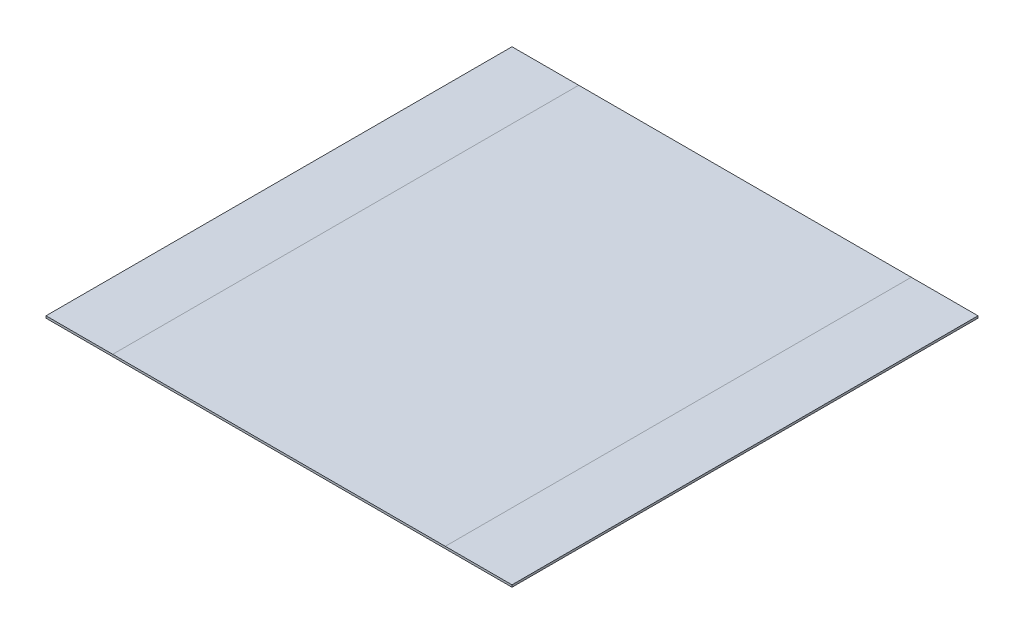
ISO-10303-21;
HEADER;
FILE_DESCRIPTION(('STEP AP214'),'2;1');
FILE_NAME('part.step','',(''),(''),'','','');
FILE_SCHEMA(('AUTOMOTIVE_DESIGN { 1 0 10303 214 1 1 1 1 }'));
ENDSEC;
DATA;
#1=APPLICATION_CONTEXT('core data for automotive mechanical design processes');
#2=APPLICATION_PROTOCOL_DEFINITION('international standard','automotive_design',2000,#1);
#3=PRODUCT_CONTEXT('',#1,'mechanical');
#4=PRODUCT('Part','Part','',(#3));
#5=PRODUCT_RELATED_PRODUCT_CATEGORY('part','',(#4));
#6=PRODUCT_DEFINITION_FORMATION('','',#4);
#7=PRODUCT_DEFINITION_CONTEXT('part definition',#1,'design');
#8=PRODUCT_DEFINITION('design','',#6,#7);
#9=PRODUCT_DEFINITION_SHAPE('','',#8);
#10=(LENGTH_UNIT() NAMED_UNIT(*) SI_UNIT(.MILLI.,.METRE.));
#11=(NAMED_UNIT(*) PLANE_ANGLE_UNIT() SI_UNIT($,.RADIAN.));
#12=(NAMED_UNIT(*) SI_UNIT($,.STERADIAN.) SOLID_ANGLE_UNIT());
#13=UNCERTAINTY_MEASURE_WITH_UNIT(LENGTH_MEASURE(1.E-05),#10,'distance_accuracy_value','');
#14=(GEOMETRIC_REPRESENTATION_CONTEXT(3) GLOBAL_UNCERTAINTY_ASSIGNED_CONTEXT((#13)) GLOBAL_UNIT_ASSIGNED_CONTEXT((#10,
#11,#12)) REPRESENTATION_CONTEXT('',''));
#15=CARTESIAN_POINT('',(0.,0.,0.));
#16=DIRECTION('',(0.,0.,1.));
#17=DIRECTION('',(1.,0.,0.));
#18=AXIS2_PLACEMENT_3D('',#15,#16,#17);
#19=CARTESIAN_POINT('',(0.,0.32,0.));
#20=DIRECTION('',(0.,-1.,0.));
#21=DIRECTION('',(0.,0.,-1.));
#22=AXIS2_PLACEMENT_3D('',#19,#20,#21);
#23=PLANE('',#22);
#24=DIRECTION('',(0.,0.,1.));
#25=VECTOR('',#24,1.);
#26=CARTESIAN_POINT('',(49.85,0.32,0.));
#27=LINE('',#26,#25);
#28=CARTESIAN_POINT('',(49.85,0.32,-69.85));
#29=VERTEX_POINT('',#28);
#30=CARTESIAN_POINT('',(49.85,0.32,69.85));
#31=VERTEX_POINT('',#30);
#32=EDGE_CURVE('E11',#29,#31,#27,.T.);
#33=ORIENTED_EDGE('',*,*,#32,.F.);
#34=DIRECTION('',(-1.,0.,0.));
#35=VECTOR('',#34,1.);
#36=CARTESIAN_POINT('',(-69.85,0.32,-69.85));
#37=LINE('',#36,#35);
#38=CARTESIAN_POINT('',(-49.85,0.32,-69.85));
#39=VERTEX_POINT('',#38);
#40=EDGE_CURVE('E99',#29,#39,#37,.T.);
#41=ORIENTED_EDGE('',*,*,#40,.T.);
#42=DIRECTION('',(0.,0.,-1.));
#43=VECTOR('',#42,1.);
#44=CARTESIAN_POINT('',(-49.85,0.32,0.));
#45=LINE('',#44,#43);
#46=CARTESIAN_POINT('',(-49.85,0.32,69.85));
#47=VERTEX_POINT('',#46);
#48=EDGE_CURVE('E51',#47,#39,#45,.T.);
#49=ORIENTED_EDGE('',*,*,#48,.F.);
#50=DIRECTION('',(1.,0.,0.));
#51=VECTOR('',#50,1.);
#52=CARTESIAN_POINT('',(-69.85,0.32,69.85));
#53=LINE('',#52,#51);
#54=EDGE_CURVE('E146',#47,#31,#53,.T.);
#55=ORIENTED_EDGE('',*,*,#54,.T.);
#56=EDGE_LOOP('',(#33,#41,#49,#55));
#57=FACE_BOUND('',#56,.T.);
#58=ADVANCED_FACE('F42',(#57),#23,.F.);
#59=CARTESIAN_POINT('',(69.85,0.32,-69.85));
#60=VERTEX_POINT('',#59);
#61=EDGE_CURVE('E92',#60,#29,#37,.T.);
#62=ORIENTED_EDGE('',*,*,#61,.T.);
#63=ORIENTED_EDGE('',*,*,#32,.T.);
#64=CARTESIAN_POINT('',(69.85,0.32,69.85));
#65=VERTEX_POINT('',#64);
#66=EDGE_CURVE('E107',#31,#65,#53,.T.);
#67=ORIENTED_EDGE('',*,*,#66,.T.);
#68=DIRECTION('',(0.,0.,-1.));
#69=VECTOR('',#68,1.);
#70=CARTESIAN_POINT('',(69.85,0.32,69.85));
#71=LINE('',#70,#69);
#72=EDGE_CURVE('E105',#65,#60,#71,.T.);
#73=ORIENTED_EDGE('',*,*,#72,.T.);
#74=EDGE_LOOP('',(#62,#63,#67,#73));
#75=FACE_BOUND('',#74,.T.);
#76=ADVANCED_FACE('F106',(#75),#23,.F.);
#77=CARTESIAN_POINT('',(69.85,0.32,69.85));
#78=DIRECTION('',(-1.,0.,0.));
#79=DIRECTION('',(0.,0.,1.));
#80=AXIS2_PLACEMENT_3D('',#77,#78,#79);
#81=PLANE('',#80);
#82=DIRECTION('',(0.,0.,-1.));
#83=VECTOR('',#82,1.);
#84=CARTESIAN_POINT('',(69.85,-0.32,69.85));
#85=LINE('',#84,#83);
#86=CARTESIAN_POINT('',(69.85,-0.32,69.85));
#87=VERTEX_POINT('',#86);
#88=CARTESIAN_POINT('',(69.85,-0.32,-69.85));
#89=VERTEX_POINT('',#88);
#90=EDGE_CURVE('E115',#87,#89,#85,.T.);
#91=ORIENTED_EDGE('',*,*,#90,.T.);
#92=DIRECTION('',(0.,-1.,0.));
#93=VECTOR('',#92,1.);
#94=CARTESIAN_POINT('',(69.85,0.32,-69.85));
#95=LINE('',#94,#93);
#96=EDGE_CURVE('E96',#60,#89,#95,.T.);
#97=ORIENTED_EDGE('',*,*,#96,.F.);
#98=ORIENTED_EDGE('',*,*,#72,.F.);
#99=DIRECTION('',(0.,-1.,0.));
#100=VECTOR('',#99,1.);
#101=CARTESIAN_POINT('',(69.85,0.32,69.85));
#102=LINE('',#101,#100);
#103=EDGE_CURVE('E129',#65,#87,#102,.T.);
#104=ORIENTED_EDGE('',*,*,#103,.T.);
#105=EDGE_LOOP('',(#91,#97,#98,#104));
#106=FACE_BOUND('',#105,.T.);
#107=ADVANCED_FACE('F44',(#106),#81,.F.);
#108=CARTESIAN_POINT('',(-69.85,0.32,-69.85));
#109=DIRECTION('',(0.,0.,1.));
#110=DIRECTION('',(1.,0.,0.));
#111=AXIS2_PLACEMENT_3D('',#108,#109,#110);
#112=PLANE('',#111);
#113=DIRECTION('',(-1.,0.,0.));
#114=VECTOR('',#113,1.);
#115=CARTESIAN_POINT('',(-69.85,-0.32,-69.85));
#116=LINE('',#115,#114);
#117=CARTESIAN_POINT('',(-69.85,-0.32,-69.85));
#118=VERTEX_POINT('',#117);
#119=EDGE_CURVE('E138',#89,#118,#116,.T.);
#120=ORIENTED_EDGE('',*,*,#119,.T.);
#121=DIRECTION('',(0.,-1.,0.));
#122=VECTOR('',#121,1.);
#123=CARTESIAN_POINT('',(-69.85,0.32,-69.85));
#124=LINE('',#123,#122);
#125=CARTESIAN_POINT('',(-69.85,0.32,-69.85));
#126=VERTEX_POINT('',#125);
#127=EDGE_CURVE('E117',#126,#118,#124,.T.);
#128=ORIENTED_EDGE('',*,*,#127,.F.);
#129=EDGE_CURVE('E103',#39,#126,#37,.T.);
#130=ORIENTED_EDGE('',*,*,#129,.F.);
#131=ORIENTED_EDGE('',*,*,#40,.F.);
#132=ORIENTED_EDGE('',*,*,#61,.F.);
#133=ORIENTED_EDGE('',*,*,#96,.T.);
#134=EDGE_LOOP('',(#120,#128,#130,#131,#132,#133));
#135=FACE_BOUND('',#134,.T.);
#136=ADVANCED_FACE('F94',(#135),#112,.F.);
#137=CARTESIAN_POINT('',(-69.85,0.32,69.85));
#138=DIRECTION('',(1.,0.,0.));
#139=DIRECTION('',(0.,0.,-1.));
#140=AXIS2_PLACEMENT_3D('',#137,#138,#139);
#141=PLANE('',#140);
#142=DIRECTION('',(0.,0.,1.));
#143=VECTOR('',#142,1.);
#144=CARTESIAN_POINT('',(-69.85,-0.32,69.85));
#145=LINE('',#144,#143);
#146=CARTESIAN_POINT('',(-69.85,-0.32,69.85));
#147=VERTEX_POINT('',#146);
#148=EDGE_CURVE('E135',#118,#147,#145,.T.);
#149=ORIENTED_EDGE('',*,*,#148,.T.);
#150=DIRECTION('',(0.,-1.,0.));
#151=VECTOR('',#150,1.);
#152=CARTESIAN_POINT('',(-69.85,0.32,69.85));
#153=LINE('',#152,#151);
#154=CARTESIAN_POINT('',(-69.85,0.32,69.85));
#155=VERTEX_POINT('',#154);
#156=EDGE_CURVE('E123',#155,#147,#153,.T.);
#157=ORIENTED_EDGE('',*,*,#156,.F.);
#158=DIRECTION('',(0.,0.,1.));
#159=VECTOR('',#158,1.);
#160=CARTESIAN_POINT('',(-69.85,0.32,69.85));
#161=LINE('',#160,#159);
#162=EDGE_CURVE('E101',#126,#155,#161,.T.);
#163=ORIENTED_EDGE('',*,*,#162,.F.);
#164=ORIENTED_EDGE('',*,*,#127,.T.);
#165=EDGE_LOOP('',(#149,#157,#163,#164));
#166=FACE_BOUND('',#165,.T.);
#167=ADVANCED_FACE('F163',(#166),#141,.F.);
#168=CARTESIAN_POINT('',(-69.85,0.32,69.85));
#169=DIRECTION('',(0.,0.,-1.));
#170=DIRECTION('',(-1.,0.,0.));
#171=AXIS2_PLACEMENT_3D('',#168,#169,#170);
#172=PLANE('',#171);
#173=DIRECTION('',(1.,0.,0.));
#174=VECTOR('',#173,1.);
#175=CARTESIAN_POINT('',(-69.85,-0.32,69.85));
#176=LINE('',#175,#174);
#177=EDGE_CURVE('E112',#147,#87,#176,.T.);
#178=ORIENTED_EDGE('',*,*,#177,.T.);
#179=ORIENTED_EDGE('',*,*,#103,.F.);
#180=ORIENTED_EDGE('',*,*,#66,.F.);
#181=ORIENTED_EDGE('',*,*,#54,.F.);
#182=EDGE_CURVE('E132',#155,#47,#53,.T.);
#183=ORIENTED_EDGE('',*,*,#182,.F.);
#184=ORIENTED_EDGE('',*,*,#156,.T.);
#185=EDGE_LOOP('',(#178,#179,#180,#181,#183,#184));
#186=FACE_BOUND('',#185,.T.);
#187=ADVANCED_FACE('F156',(#186),#172,.F.);
#188=ORIENTED_EDGE('',*,*,#182,.T.);
#189=ORIENTED_EDGE('',*,*,#48,.T.);
#190=ORIENTED_EDGE('',*,*,#129,.T.);
#191=ORIENTED_EDGE('',*,*,#162,.T.);
#192=EDGE_LOOP('',(#188,#189,#190,#191));
#193=FACE_BOUND('',#192,.T.);
#194=ADVANCED_FACE('F157',(#193),#23,.F.);
#195=CARTESIAN_POINT('',(0.,-0.32,0.));
#196=DIRECTION('',(0.,-1.,0.));
#197=DIRECTION('',(0.,0.,-1.));
#198=AXIS2_PLACEMENT_3D('',#195,#196,#197);
#199=PLANE('',#198);
#200=ORIENTED_EDGE('',*,*,#90,.F.);
#201=ORIENTED_EDGE('',*,*,#177,.F.);
#202=ORIENTED_EDGE('',*,*,#148,.F.);
#203=ORIENTED_EDGE('',*,*,#119,.F.);
#204=EDGE_LOOP('',(#200,#201,#202,#203));
#205=FACE_BOUND('',#204,.T.);
#206=ADVANCED_FACE('F166',(#205),#199,.T.);
#207=CLOSED_SHELL('',(#58,#76,#107,#136,#167,#187,#194,#206));
#208=MANIFOLD_SOLID_BREP('B2',#207);
#209=ADVANCED_BREP_SHAPE_REPRESENTATION('',(#18,#208),#14);
#210=SHAPE_DEFINITION_REPRESENTATION(#9,#209);
ENDSEC;
END-ISO-10303-21;
